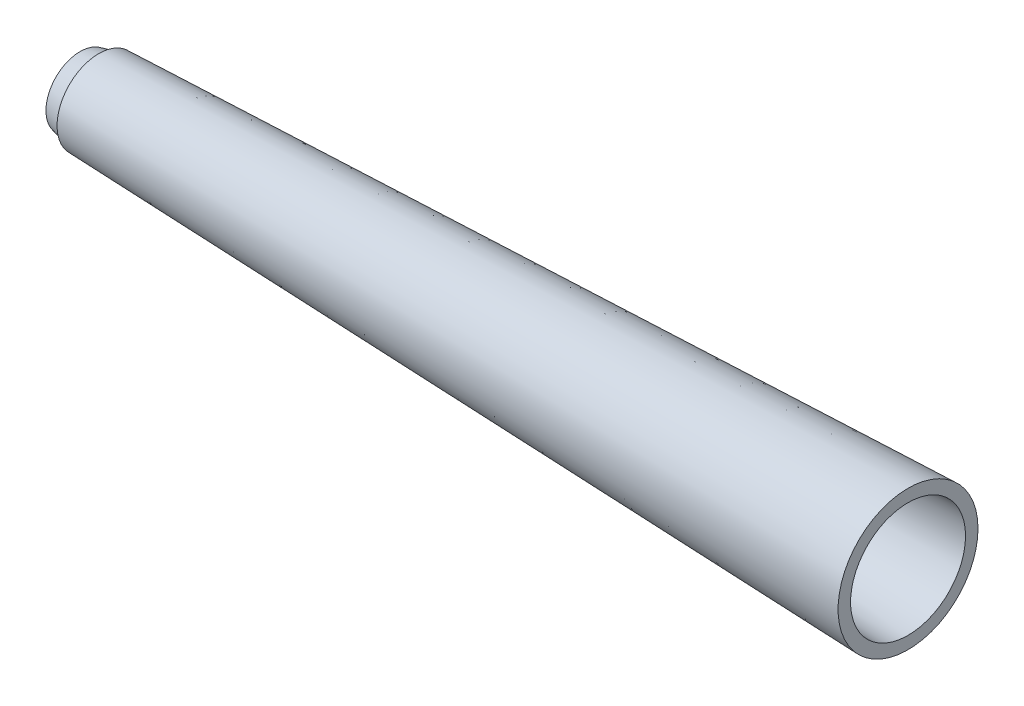
ISO-10303-21;
HEADER;
FILE_DESCRIPTION(('STEP AP214'),'2;1');
FILE_NAME('part.step','',(''),(''),'','','');
FILE_SCHEMA(('AUTOMOTIVE_DESIGN { 1 0 10303 214 1 1 1 1 }'));
ENDSEC;
DATA;
#1=APPLICATION_CONTEXT('core data for automotive mechanical design processes');
#2=APPLICATION_PROTOCOL_DEFINITION('international standard','automotive_design',2000,#1);
#3=PRODUCT_CONTEXT('',#1,'mechanical');
#4=PRODUCT('Part','Part','',(#3));
#5=PRODUCT_RELATED_PRODUCT_CATEGORY('part','',(#4));
#6=PRODUCT_DEFINITION_FORMATION('','',#4);
#7=PRODUCT_DEFINITION_CONTEXT('part definition',#1,'design');
#8=PRODUCT_DEFINITION('design','',#6,#7);
#9=PRODUCT_DEFINITION_SHAPE('','',#8);
#10=(LENGTH_UNIT() NAMED_UNIT(*) SI_UNIT(.MILLI.,.METRE.));
#11=(NAMED_UNIT(*) PLANE_ANGLE_UNIT() SI_UNIT($,.RADIAN.));
#12=(NAMED_UNIT(*) SI_UNIT($,.STERADIAN.) SOLID_ANGLE_UNIT());
#13=UNCERTAINTY_MEASURE_WITH_UNIT(LENGTH_MEASURE(1.E-05),#10,'distance_accuracy_value','');
#14=(GEOMETRIC_REPRESENTATION_CONTEXT(3) GLOBAL_UNCERTAINTY_ASSIGNED_CONTEXT((#13)) GLOBAL_UNIT_ASSIGNED_CONTEXT((#10,
#11,#12)) REPRESENTATION_CONTEXT('',''));
#15=CARTESIAN_POINT('',(0.,0.,0.));
#16=DIRECTION('',(0.,0.,1.));
#17=DIRECTION('',(1.,0.,0.));
#18=AXIS2_PLACEMENT_3D('',#15,#16,#17);
#19=CARTESIAN_POINT('',(50.,0.,0.));
#20=DIRECTION('',(1.,0.,0.));
#21=DIRECTION('',(0.,0.,-1.));
#22=AXIS2_PLACEMENT_3D('',#19,#20,#21);
#23=PLANE('',#22);
#24=CARTESIAN_POINT('',(50.,0.,-4.69512150857789));
#25=CARTESIAN_POINT('',(50.,0.0774556761758535,-4.69512749262268));
#26=CARTESIAN_POINT('',(50.,0.154915312597304,-4.69327648573209));
#27=CARTESIAN_POINT('',(50.,0.309100210130943,-4.68582458036986));
#28=CARTESIAN_POINT('',(50.,0.385826771823269,-4.68025048931462));
#29=CARTESIAN_POINT('',(50.,0.538546502530484,-4.66535384235011));
#30=CARTESIAN_POINT('',(50.,0.614541424083018,-4.65604932218945));
#31=CARTESIAN_POINT('',(50.,0.76579697551787,-4.63370275998921));
#32=CARTESIAN_POINT('',(50.,0.841058913887476,-4.62066957845393));
#33=CARTESIAN_POINT('',(50.,0.990849253858552,-4.59087446234744));
#34=CARTESIAN_POINT('',(50.,1.06537757810596,-4.57411213887261));
#35=CARTESIAN_POINT('',(50.,1.213702240403,-4.53686835826448));
#36=CARTESIAN_POINT('',(50.,1.28749620492464,-4.51637745343878));
#37=CARTESIAN_POINT('',(50.,1.43435449893985,-4.47168482052722));
#38=CARTESIAN_POINT('',(50.,1.50741332942991,-4.44746503631701));
#39=CARTESIAN_POINT('',(50.,1.65280508571756,-4.39532565627679));
#40=CARTESIAN_POINT('',(50.,1.72512869039417,-4.36738010304966));
#41=CARTESIAN_POINT('',(50.,1.86828646672253,-4.30810439259191));
#42=CARTESIAN_POINT('',(50.,1.93912212392569,-4.27677782356728));
#43=CARTESIAN_POINT('',(50.,2.07868486110722,-4.21092800335479));
#44=CARTESIAN_POINT('',(50.,2.14742326666067,-4.17642878296646));
#45=CARTESIAN_POINT('',(50.,2.28279417229262,-4.10424450232997));
#46=CARTESIAN_POINT('',(50.,2.34943502362547,-4.06657511019382));
#47=CARTESIAN_POINT('',(50.,2.48061389131729,-3.9880583457423));
#48=CARTESIAN_POINT('',(50.,2.54515631183587,-3.94721833343439));
#49=CARTESIAN_POINT('',(50.,2.67214247439441,-3.86236883793473));
#50=CARTESIAN_POINT('',(50.,2.73458577583404,-3.81835869535734));
#51=CARTESIAN_POINT('',(50.,2.85737884086232,-3.72717707392558));
#52=CARTESIAN_POINT('',(50.,2.91772255538123,-3.67999745096399));
#53=CARTESIAN_POINT('',(50.,3.03632172731316,-3.58248358830625));
#54=CARTESIAN_POINT('',(50.,3.09456493859665,-3.53213446103621));
#55=CARTESIAN_POINT('',(50.,3.20897113881356,-3.42829067721484));
#56=CARTESIAN_POINT('',(50.,3.26511532154908,-3.37477531936968));
#57=CARTESIAN_POINT('',(50.,3.37471148813169,-3.26520688013156));
#58=CARTESIAN_POINT('',(50.,3.42816717413037,-3.20915750218508));
#59=CARTESIAN_POINT('',(50.,3.53190686308197,-3.09491202108239));
#60=CARTESIAN_POINT('',(50.,3.58221052774977,-3.03673378743318));
#61=CARTESIAN_POINT('',(50.,3.67965316388938,-2.91823996070821));
#62=CARTESIAN_POINT('',(50.,3.72680584647773,-2.85793564683152));
#63=CARTESIAN_POINT('',(50.,3.81795226441296,-2.73519564771483));
#64=CARTESIAN_POINT('',(50.,3.86195288527225,-2.67276507688261));
#65=CARTESIAN_POINT('',(50.,3.94680230241528,-2.54577886092025));
#66=CARTESIAN_POINT('',(50.,3.98765043930259,-2.4812227752088));
#67=CARTESIAN_POINT('',(50.,4.06620274381422,-2.34999107068442));
#68=CARTESIAN_POINT('',(50.,4.10389820620797,-2.28331024257235));
#69=CARTESIAN_POINT('',(50.,4.17615261383283,-2.14783324230592));
#70=CARTESIAN_POINT('',(50.,4.2106945478897,-2.07902800221967));
#71=CARTESIAN_POINT('',(50.,4.27665279910241,-1.93930749844782));
#72=CARTESIAN_POINT('',(50.,4.30804381955396,-1.86838030608012));
#73=CARTESIAN_POINT('',(50.,4.36736744827808,-1.72521163043995));
#74=CARTESIAN_POINT('',(50.,4.39530489414029,-1.65297215195379));
#75=CARTESIAN_POINT('',(50.,4.44742801663569,-1.50772363004483));
#76=CARTESIAN_POINT('',(50.,4.47163869668915,-1.43472357168134));
#77=CARTESIAN_POINT('',(50.,4.51631832948614,-1.28795986798325));
#78=CARTESIAN_POINT('',(50.,4.53680426601222,-1.21420139625269));
#79=CARTESIAN_POINT('',(50.,4.57404201185416,-1.06592419918533));
#80=CARTESIAN_POINT('',(50.,4.59080213975315,-0.991407563973682));
#81=CARTESIAN_POINT('',(50.,4.6205972586095,-0.841617131948437));
#82=CARTESIAN_POINT('',(50.,4.63363147176082,-0.766343180430876));
#83=CARTESIAN_POINT('',(50.,4.65598413900821,-0.615040229093642));
#84=CARTESIAN_POINT('',(50.,4.66529255700744,-0.53900974785662));
#85=CARTESIAN_POINT('',(50.,4.68020212187726,-0.3861947554712));
#86=CARTESIAN_POINT('',(50.,4.68578408232483,-0.309408376540679));
#87=CARTESIAN_POINT('',(50.,4.69325283866525,-0.155082332867053));
#88=CARTESIAN_POINT('',(50.,4.69511169854175,-0.0775413280883341));
#89=CARTESIAN_POINT('',(50.,4.69513130471307,0.077431450892754));
#90=CARTESIAN_POINT('',(50.,4.69329728755643,0.154863224179503));
#91=CARTESIAN_POINT('',(50.,4.68586857069038,0.309002016120885));
#92=CARTESIAN_POINT('',(50.,4.68030040956254,0.385710302057824));
#93=CARTESIAN_POINT('',(50.,4.66541496994597,0.538400439255638));
#94=CARTESIAN_POINT('',(50.,4.65611536227887,0.614384010141844));
#95=CARTESIAN_POINT('',(50.,4.63377532678387,0.765624546042876));
#96=CARTESIAN_POINT('',(50.,4.62074338418093,0.84088276341779));
#97=CARTESIAN_POINT('',(50.,4.59094816799817,0.99067317608361));
#98=CARTESIAN_POINT('',(50.,4.57418411661665,1.06520521664885));
#99=CARTESIAN_POINT('',(50.,4.53693415563886,1.2135449120226));
#100=CARTESIAN_POINT('',(50.,4.51643840698427,1.28735009483429));
#101=CARTESIAN_POINT('',(50.,4.47173328300328,1.43423838201946));
#102=CARTESIAN_POINT('',(50.,4.44750546696408,1.50731586967241));
#103=CARTESIAN_POINT('',(50.,4.39534767798401,1.65275271206771));
#104=CARTESIAN_POINT('',(50.,4.36739138271999,1.72510261419092));
#105=CARTESIAN_POINT('',(50.,4.30810398147681,1.86828629574479));
#106=CARTESIAN_POINT('',(50.,4.27677771378806,1.9391220782699));
#107=CARTESIAN_POINT('',(50.,4.21092811236203,2.07868490644209));
#108=CARTESIAN_POINT('',(50.,4.17642881210913,2.14742327878085));
#109=CARTESIAN_POINT('',(50.,4.10424447332384,2.28279416022946));
#110=CARTESIAN_POINT('',(50.,4.06657510242974,2.34943502039662));
#111=CARTESIAN_POINT('',(50.,3.98805835348902,2.48061389453921));
#112=CARTESIAN_POINT('',(50.,3.94721833551059,2.54515631269949));
#113=CARTESIAN_POINT('',(50.,3.86236883585826,2.67214247353098));
#114=CARTESIAN_POINT('',(50.,3.81835869480021,2.73458577560249));
#115=CARTESIAN_POINT('',(50.,3.72717707448435,2.85737884109484));
#116=CARTESIAN_POINT('',(50.,3.67999745111415,2.91772255544381));
#117=CARTESIAN_POINT('',(50.,3.58248358815544,3.03632172725055));
#118=CARTESIAN_POINT('',(50.,3.5321344609957,3.09456493857989));
#119=CARTESIAN_POINT('',(50.,3.42829067725573,3.20897113883061));
#120=CARTESIAN_POINT('',(50.,3.37477531938064,3.26511532155365));
#121=CARTESIAN_POINT('',(50.,3.26520688012053,3.37471148812721));
#122=CARTESIAN_POINT('',(50.,3.20915750218196,3.42816717412927));
#123=CARTESIAN_POINT('',(50.,3.09491202108492,3.53190686308339));
#124=CARTESIAN_POINT('',(50.,3.03673378743352,3.58221052775035));
#125=CARTESIAN_POINT('',(50.,2.91823996070689,3.67965316388938));
#126=CARTESIAN_POINT('',(50.,2.85793564683073,3.72680584647799));
#127=CARTESIAN_POINT('',(50.,2.73519564771439,3.81795226441342));
#128=CARTESIAN_POINT('',(50.,2.67276507688201,3.86195288527266));
#129=CARTESIAN_POINT('',(50.,2.54577886091954,3.94680230241565));
#130=CARTESIAN_POINT('',(50.,2.48122277520814,3.98765043930297));
#131=CARTESIAN_POINT('',(50.,2.34999107068385,4.06620274381458));
#132=CARTESIAN_POINT('',(50.,2.28331024257181,4.10389820620829));
#133=CARTESIAN_POINT('',(50.,2.14783324230549,4.17615261383309));
#134=CARTESIAN_POINT('',(50.,2.07902800221931,4.21069454788991));
#135=CARTESIAN_POINT('',(50.,1.93930749844763,4.27665279910253));
#136=CARTESIAN_POINT('',(50.,1.86838030608002,4.30804381955402));
#137=CARTESIAN_POINT('',(50.,1.72521163043991,4.36736744827808));
#138=CARTESIAN_POINT('',(50.,1.65297215195371,4.39530489414029));
#139=CARTESIAN_POINT('',(50.,1.50772363004468,4.44742801663568));
#140=CARTESIAN_POINT('',(50.,1.43472357168115,4.47163869668915));
#141=CARTESIAN_POINT('',(50.,1.28795986798301,4.51631832948614));
#142=CARTESIAN_POINT('',(50.,1.21420139625243,4.53680426601222));
#143=CARTESIAN_POINT('',(50.,1.06592419918504,4.57404201185416));
#144=CARTESIAN_POINT('',(50.,0.991407563973395,4.59080213975315));
#145=CARTESIAN_POINT('',(50.,0.84161713194815,4.6205972586095));
#146=CARTESIAN_POINT('',(50.,0.766343180430595,4.63363147176082));
#147=CARTESIAN_POINT('',(50.,0.615040229093385,4.6559841390082));
#148=CARTESIAN_POINT('',(50.,0.539009747856382,4.66529255700744));
#149=CARTESIAN_POINT('',(50.,0.386194755471011,4.68020212187726));
#150=CARTESIAN_POINT('',(50.,0.309408376540521,4.68578408232483));
#151=CARTESIAN_POINT('',(50.,0.155082332866968,4.69325283866525));
#152=CARTESIAN_POINT('',(50.,0.0775413280882919,4.69511169854175));
#153=CARTESIAN_POINT('',(50.,-0.0774314508927209,4.69513130471307));
#154=CARTESIAN_POINT('',(50.,-0.154863224179438,4.69329728755643));
#155=CARTESIAN_POINT('',(50.,-0.309002016120763,4.68586857069038));
#156=CARTESIAN_POINT('',(50.,-0.385710302057679,4.68030040956254));
#157=CARTESIAN_POINT('',(50.,-0.538400439255456,4.66541496994597));
#158=CARTESIAN_POINT('',(50.,-0.614384010141647,4.65611536227887));
#159=CARTESIAN_POINT('',(50.,-0.76562454604266,4.63377532678387));
#160=CARTESIAN_POINT('',(50.,-0.840882763417571,4.62074338418092));
#161=CARTESIAN_POINT('',(50.,-0.99067317608339,4.59094816799817));
#162=CARTESIAN_POINT('',(50.,-1.06520521664864,4.57418411661665));
#163=CARTESIAN_POINT('',(50.,-1.2135449120224,4.53693415563886));
#164=CARTESIAN_POINT('',(50.,-1.28735009483411,4.51643840698427));
#165=CARTESIAN_POINT('',(50.,-1.43423838201932,4.47173328300328));
#166=CARTESIAN_POINT('',(50.,-1.50731586967228,4.44750546696408));
#167=CARTESIAN_POINT('',(50.,-1.65275271206764,4.39534767798401));
#168=CARTESIAN_POINT('',(50.,-1.72510261419089,4.36739138271999));
#169=CARTESIAN_POINT('',(50.,-1.86828629574473,4.30810398147684));
#170=CARTESIAN_POINT('',(50.,-1.93912207826978,4.27677771378814));
#171=CARTESIAN_POINT('',(50.,-2.07868490644188,4.21092811236217));
#172=CARTESIAN_POINT('',(50.,-2.1474232787806,4.17642881210929));
#173=CARTESIAN_POINT('',(50.,-2.28279416022914,4.10424447332404));
#174=CARTESIAN_POINT('',(50.,-2.34943502039628,4.06657510242997));
#175=CARTESIAN_POINT('',(50.,-2.48061389453883,3.98805835348926));
#176=CARTESIAN_POINT('',(50.,-2.54515631269911,3.94721833551084));
#177=CARTESIAN_POINT('',(50.,-2.6721424735306,3.86236883585851));
#178=CARTESIAN_POINT('',(50.,-2.73458577560212,3.81835869480046));
#179=CARTESIAN_POINT('',(50.,-2.8573788410945,3.72717707448457));
#180=CARTESIAN_POINT('',(50.,-2.9177225554435,3.67999745111436));
#181=CARTESIAN_POINT('',(50.,-3.03632172725029,3.58248358815561));
#182=CARTESIAN_POINT('',(50.,-3.09456493857968,3.53213446099584));
#183=CARTESIAN_POINT('',(50.,-3.2089711388305,3.42829067725581));
#184=CARTESIAN_POINT('',(50.,-3.2651153215536,3.37477531938067));
#185=CARTESIAN_POINT('',(50.,-3.37471148812714,3.26520688012062));
#186=CARTESIAN_POINT('',(50.,-3.42816717412914,3.20915750218214));
#187=CARTESIAN_POINT('',(50.,-3.53190686308314,3.09491202108524));
#188=CARTESIAN_POINT('',(50.,-3.58221052775005,3.0367337874339));
#189=CARTESIAN_POINT('',(50.,-3.679653163889,2.91823996070738));
#190=CARTESIAN_POINT('',(50.,-3.72680584647759,2.85793564683125));
#191=CARTESIAN_POINT('',(50.,-3.81795226441298,2.73519564771497));
#192=CARTESIAN_POINT('',(50.,-3.8619528852722,2.6727650768826));
#193=CARTESIAN_POINT('',(50.,-3.94680230241519,2.54577886092012));
#194=CARTESIAN_POINT('',(50.,-3.98765043930252,2.48122277520871));
#195=CARTESIAN_POINT('',(50.,-4.06620274381417,2.34999107068438));
#196=CARTESIAN_POINT('',(50.,-4.10389820620791,2.2833102425723));
#197=CARTESIAN_POINT('',(50.,-4.17615261383278,2.14783324230587));
#198=CARTESIAN_POINT('',(50.,-4.21069454788966,2.07902800221964));
#199=CARTESIAN_POINT('',(50.,-4.27665279910239,1.9393074984478));
#200=CARTESIAN_POINT('',(50.,-4.30804381955395,1.86838030608011));
#201=CARTESIAN_POINT('',(50.,-4.36736744827808,1.72521163043999));
#202=CARTESIAN_POINT('',(50.,-4.39530489414029,1.65297215195386));
#203=CARTESIAN_POINT('',(50.,-4.44742801663569,1.50772363004496));
#204=CARTESIAN_POINT('',(50.,-4.47163869668915,1.43472357168149));
#205=CARTESIAN_POINT('',(50.,-4.51631832948614,1.28795986798344));
#206=CARTESIAN_POINT('',(50.,-4.53680426601222,1.21420139625289));
#207=CARTESIAN_POINT('',(50.,-4.57404201185416,1.06592419918554));
#208=CARTESIAN_POINT('',(50.,-4.59080213975315,0.991407563973905));
#209=CARTESIAN_POINT('',(50.,-4.6205972586095,0.84161713194866));
#210=CARTESIAN_POINT('',(50.,-4.63363147176082,0.766343180431094));
#211=CARTESIAN_POINT('',(50.,-4.65598413900821,0.615040229093841));
#212=CARTESIAN_POINT('',(50.,-4.66529255700744,0.539009747856804));
#213=CARTESIAN_POINT('',(50.,-4.68020212187726,0.386194755471347));
#214=CARTESIAN_POINT('',(50.,-4.68578408232483,0.309408376540803));
#215=CARTESIAN_POINT('',(50.,-4.69325283866525,0.15508233286712));
#216=CARTESIAN_POINT('',(50.,-4.69511169854175,0.0775413280883679));
#217=CARTESIAN_POINT('',(50.,-4.69513130471307,-0.077431450892796));
#218=CARTESIAN_POINT('',(50.,-4.69329728755643,-0.154863224179588));
#219=CARTESIAN_POINT('',(50.,-4.68586857069038,-0.309002016121043));
#220=CARTESIAN_POINT('',(50.,-4.68030040956254,-0.385710302058013));
#221=CARTESIAN_POINT('',(50.,-4.66541496994597,-0.538400439255876));
#222=CARTESIAN_POINT('',(50.,-4.65611536227887,-0.6143840101421));
#223=CARTESIAN_POINT('',(50.,-4.63377532678387,-0.765624546043157));
#224=CARTESIAN_POINT('',(50.,-4.62074338418093,-0.840882763418078));
#225=CARTESIAN_POINT('',(50.,-4.59094816799818,-0.990673176083897));
#226=CARTESIAN_POINT('',(50.,-4.57418411661665,-1.06520521664913));
#227=CARTESIAN_POINT('',(50.,-4.53693415563886,-1.21354491202286));
#228=CARTESIAN_POINT('',(50.,-4.51643840698428,-1.28735009483453));
#229=CARTESIAN_POINT('',(50.,-4.47173328300328,-1.43423838201966));
#230=CARTESIAN_POINT('',(50.,-4.44750546696408,-1.50731586967257));
#231=CARTESIAN_POINT('',(50.,-4.39534767798401,-1.6527527120678));
#232=CARTESIAN_POINT('',(50.,-4.36739138271999,-1.72510261419097));
#233=CARTESIAN_POINT('',(50.,-4.30810398147676,-1.86828629574486));
#234=CARTESIAN_POINT('',(50.,-4.27677771378797,-1.93912207827003));
#235=CARTESIAN_POINT('',(50.,-4.21092811236186,-2.07868490644233));
#236=CARTESIAN_POINT('',(50.,-4.17642881210893,-2.14742327878113));
#237=CARTESIAN_POINT('',(50.,-4.10424447332359,-2.28279416022981));
#238=CARTESIAN_POINT('',(50.,-4.06657510242948,-2.34943502039702));
#239=CARTESIAN_POINT('',(50.,-3.98805835348872,-2.48061389453961));
#240=CARTESIAN_POINT('',(50.,-3.94721833551027,-2.54515631269986));
#241=CARTESIAN_POINT('',(50.,-3.86236883585799,-2.67214247353147));
#242=CARTESIAN_POINT('',(50.,-3.81835869480001,-2.73458577560312));
#243=CARTESIAN_POINT('',(50.,-3.727177074484,-2.85737884109502));
#244=CARTESIAN_POINT('',(50.,-3.67999745111359,-2.91772255544339));
#245=CARTESIAN_POINT('',(50.,-3.58248358815557,-3.03632172725161));
#246=CARTESIAN_POINT('',(50.,-3.53213446099675,-3.09456493858304));
#247=CARTESIAN_POINT('',(50.,-3.42829067725442,-3.20897113882781));
#248=CARTESIAN_POINT('',(50.,-3.37477531937602,-3.26511532154274));
#249=CARTESIAN_POINT('',(50.,-3.26520688012512,-3.37471148813813));
#250=CARTESIAN_POINT('',(50.,-3.20915750219905,-3.42816717417008));
#251=CARTESIAN_POINT('',(50.,-3.09491202106806,-3.53190686304264));
#252=CARTESIAN_POINT('',(50.,-3.03673378737065,-3.58221052759914));
#253=CARTESIAN_POINT('',(50.,-2.91823996076967,-3.67965316403947));
#254=CARTESIAN_POINT('',(50.,-2.85793564706415,-3.72680584703739));
#255=CARTESIAN_POINT('',(50.,-2.73519564748175,-3.81795226385479));
#256=CARTESIAN_POINT('',(50.,-2.67276507601446,-3.86195288319106));
#257=CARTESIAN_POINT('',(50.,-2.54577886178754,-3.94680230449715));
#258=CARTESIAN_POINT('',(50.,-2.48122277844722,-3.98765044707204));
#259=CARTESIAN_POINT('',(50.,-2.34999106743636,-4.06620273602421));
#260=CARTESIAN_POINT('',(50.,-2.28331023043661,-4.1038981770988));
#261=CARTESIAN_POINT('',(50.,-2.1478332545029,-4.17615264309091));
#262=CARTESIAN_POINT('',(50.,-2.07902804785243,-4.21069465735085));
#263=CARTESIAN_POINT('',(50.,-1.93930745247348,-4.27665268882305));
#264=CARTESIAN_POINT('',(50.,-1.86838013387628,-4.30804340648466));
#265=CARTESIAN_POINT('',(50.,-1.72518553597382,-4.36737874474295));
#266=CARTESIAN_POINT('',(50.,-1.65291974233676,-4.3953269502958));
#267=CARTESIAN_POINT('',(50.,-1.50762610167962,-4.4474685138979));
#268=CARTESIAN_POINT('',(50.,-1.43460737198423,-4.47168724214362));
#269=CARTESIAN_POINT('',(50.,-1.28781365743628,-4.51637937743146));
#270=CARTESIAN_POINT('',(50.,-1.21404396412532,-4.53687015375063));
#271=CARTESIAN_POINT('',(50.,-1.06575171069198,-4.57411412227401));
#272=CARTESIAN_POINT('',(50.,-0.991231339343665,-4.59087602482301));
#273=CARTESIAN_POINT('',(50.,-0.841440881345585,-4.62067112333707));
#274=CARTESIAN_POINT('',(50.,-0.766170717343436,-4.63370393037967));
#275=CARTESIAN_POINT('',(50.,-0.614882616948982,-4.65605051101887));
#276=CARTESIAN_POINT('',(50.,-0.538863254456393,-4.66535462510893));
#277=CARTESIAN_POINT('',(50.,-0.386078533048034,-4.68025127508642));
#278=CARTESIAN_POINT('',(50.,-0.30931134481741,-4.68582497437604));
#279=CARTESIAN_POINT('',(50.,-0.155028968040738,-4.69327686297905));
#280=CARTESIAN_POINT('',(50.,-0.0775124416546672,-4.69512746288594));
#281=CARTESIAN_POINT('',(50.,0.,-4.69512150857789));
#282=B_SPLINE_CURVE_WITH_KNOTS('',3,(#24,#25,#26,#27,#28,#29,#30,#31,#32,#33,#34,#35,#36,#37,
#38,#39,#40,#41,#42,#43,#44,#45,#46,#47,#48,#49,#50,#51,#52,#53,#54,#55,#56,#57,#58,#59,#60,#61,
#62,#63,#64,#65,#66,#67,#68,#69,#70,#71,#72,#73,#74,#75,#76,#77,#78,#79,#80,#81,#82,#83,#84,#85,
#86,#87,#88,#89,#90,#91,#92,#93,#94,#95,#96,#97,#98,#99,#100,#101,#102,#103,#104,#105,#106,#107,
#108,#109,#110,#111,#112,#113,#114,#115,#116,#117,#118,#119,#120,#121,#122,#123,#124,#125,#126,
#127,#128,#129,#130,#131,#132,#133,#134,#135,#136,#137,#138,#139,#140,#141,#142,#143,#144,#145,
#146,#147,#148,#149,#150,#151,#152,#153,#154,#155,#156,#157,#158,#159,#160,#161,#162,#163,#164,
#165,#166,#167,#168,#169,#170,#171,#172,#173,#174,#175,#176,#177,#178,#179,#180,#181,#182,#183,
#184,#185,#186,#187,#188,#189,#190,#191,#192,#193,#194,#195,#196,#197,#198,#199,#200,#201,#202,
#203,#204,#205,#206,#207,#208,#209,#210,#211,#212,#213,#214,#215,#216,#217,#218,#219,#220,#221,
#222,#223,#224,#225,#226,#227,#228,#229,#230,#231,#232,#233,#234,#235,#236,#237,#238,#239,#240,
#241,#242,#243,#244,#245,#246,#247,#248,#249,#250,#251,#252,#253,#254,#255,#256,#257,#258,#259,
#260,#261,#262,#263,#264,#265,#266,#267,#268,#269,#270,#271,#272,#273,#274,#275,#276,#277,#278,
#279,#280,#281),.UNSPECIFIED.,.F.,.F.,(4,2,2,2,2,2,2,2,2,2,2,2,2,2,2,2,2,2,2,2,2,2,2,2,2,2,2,2,
2,2,2,2,2,2,2,2,2,2,2,2,2,2,2,2,2,2,2,2,2,2,2,2,2,2,2,2,2,2,2,2,2,2,2,2,2,2,2,2,2,2,2,2,2,2,2,2,
2,2,2,2,2,2,2,2,2,2,2,2,2,2,2,2,2,2,2,2,2,2,2,2,2,2,2,2,2,2,2,2,2,2,2,2,2,2,2,2,2,2,2,2,2,2,2,2,
2,2,2,2,4),(0.,0.232350454528204,0.463045690710972,0.692638766331721,0.921690722983873,
1.1507665781432,1.38043117290126,1.61124502614973,1.84376034546233,2.07603128317391,
2.30666872164152,2.53622659509988,2.7652666707131,2.99435452489448,3.22405538113213,
3.45492996073226,3.68753049680452,3.91980143451585,4.15043887298327,4.37999674644153,
4.6090368220547,4.83812467623613,5.0678255324739,5.29870011207423,5.53130064814679,
5.76357158585854,5.99420902432625,6.22376689778469,6.45280697339792,6.68189482757929,
6.91159568381688,7.14247026341692,7.37507079948907,7.60734173720091,7.8379791756687,
8.06753704912718,8.29657712474043,8.52566497892178,8.75536583515932,8.98624041475927,
9.2188409508313,9.45111188854294,9.68174932701059,9.91130720046898,10.1403472760822,
10.3694351302636,10.5991359865012,10.8300105661013,11.0626111021735,11.2948820398852,
11.5255194783529,11.7550773518113,11.9841174274245,12.2132052816059,12.4429061378435,
12.6737807174436,12.9063812535158,13.1386521912277,13.3692896296955,13.598847503154,
13.8278875787672,14.0569754329486,14.2866762891861,14.517550868786,14.7501514048581,
14.9824223425698,15.2130597810375,15.442617654496,15.6716577301092,15.9007455842906,
16.1304464405281,16.3613210201282,16.5939215562003,16.8261924939117,17.0568299323792,
17.2863878058375,17.5154278814507,17.7445157356321,17.9742165918698,18.2050911714701,
18.4376917075425,18.6699626452539,18.9006000837213,19.1301579571795,19.3591980327927,
19.5882858869741,19.8179867432119,20.0488613228122,20.2814618588848,20.5137327965964,
20.7443702350641,20.9739281085225,21.2029681841357,21.4320560383171,21.6617568945547,
21.8926314741548,22.125232010227,22.357502947939,22.5881403864069,22.8176982598654,
23.0467383354787,23.27582618966,23.5055270458975,23.7364016254974,23.9690021615693,
24.2012730992812,24.431910537749,24.6614684112075,24.8905084868207,25.1195963410021,
25.3492971972396,25.5801717768395,25.8127723129115,26.0450432506231,26.2756806890906,
26.505238562549,26.7342786381622,26.9633664923436,27.1930673485813,27.4239419281814,
27.6565424642537,27.8888986897661,28.1195969045399,28.3491910686352,28.5782431526571,
28.8073191167483,29.03698474451,29.2678014833906,29.5003224425342),.UNSPECIFIED.);
#283=CARTESIAN_POINT('',(50.,0.,-4.69512150857789));
#284=VERTEX_POINT('',#283);
#285=EDGE_CURVE('E76',#284,#284,#282,.T.);
#286=ORIENTED_EDGE('',*,*,#285,.T.);
#287=EDGE_LOOP('',(#286));
#288=FACE_BOUND('',#287,.T.);
#289=CARTESIAN_POINT('',(50.,0.,0.));
#290=DIRECTION('',(1.,0.,0.));
#291=DIRECTION('',(0.,0.,-1.));
#292=AXIS2_PLACEMENT_3D('',#289,#290,#291);
#293=CIRCLE('',#292,5.19634059717554);
#294=CARTESIAN_POINT('',(50.,0.,-5.19634059717554));
#295=VERTEX_POINT('',#294);
#296=EDGE_CURVE('E11',#295,#295,#293,.T.);
#297=ORIENTED_EDGE('',*,*,#296,.F.);
#298=EDGE_LOOP('',(#297));
#299=FACE_BOUND('',#298,.T.);
#300=ADVANCED_FACE('F44',(#288,#299),#23,.F.);
#301=CARTESIAN_POINT('',(50.,0.,0.));
#302=DIRECTION('',(1.,0.,0.));
#303=DIRECTION('',(0.,0.,-1.));
#304=AXIS2_PLACEMENT_3D('',#301,#302,#303);
#305=CONICAL_SURFACE('',#304,4.69512150857789,0.0349065850398873);
#306=CARTESIAN_POINT('',(180.,0.,0.));
#307=DIRECTION('',(1.,0.,0.));
#308=DIRECTION('',(0.,0.,-1.));
#309=AXIS2_PLACEMENT_3D('',#306,#307,#308);
#310=CIRCLE('',#309,9.2348215425052);
#311=CARTESIAN_POINT('',(180.,0.,-9.2348215425052));
#312=VERTEX_POINT('',#311);
#313=EDGE_CURVE('E55',#312,#312,#310,.T.);
#314=ORIENTED_EDGE('',*,*,#313,.T.);
#315=EDGE_LOOP('',(#314));
#316=FACE_BOUND('',#315,.T.);
#317=ORIENTED_EDGE('',*,*,#285,.F.);
#318=EDGE_LOOP('',(#317));
#319=FACE_BOUND('',#318,.T.);
#320=ADVANCED_FACE('F46',(#316,#319),#305,.F.);
#321=CARTESIAN_POINT('',(180.,9.2348215425052,0.));
#322=DIRECTION('',(1.,0.,0.));
#323=DIRECTION('',(0.,0.,-1.));
#324=AXIS2_PLACEMENT_3D('',#321,#322,#323);
#325=PLANE('',#324);
#326=CARTESIAN_POINT('',(180.,0.,0.));
#327=DIRECTION('',(1.,0.,0.));
#328=DIRECTION('',(0.,0.,-1.));
#329=AXIS2_PLACEMENT_3D('',#326,#327,#328);
#330=CIRCLE('',#329,11.2360406311028);
#331=CARTESIAN_POINT('',(180.,0.,-11.2360406311028));
#332=VERTEX_POINT('',#331);
#333=EDGE_CURVE('E61',#332,#332,#330,.T.);
#334=ORIENTED_EDGE('',*,*,#333,.T.);
#335=EDGE_LOOP('',(#334));
#336=FACE_BOUND('',#335,.T.);
#337=ORIENTED_EDGE('',*,*,#313,.F.);
#338=EDGE_LOOP('',(#337));
#339=FACE_BOUND('',#338,.T.);
#340=ADVANCED_FACE('F100',(#336,#339),#325,.T.);
#341=CARTESIAN_POINT('',(180.,0.,0.));
#342=DIRECTION('',(1.,0.,0.));
#343=DIRECTION('',(0.,0.,-1.));
#344=AXIS2_PLACEMENT_3D('',#341,#342,#343);
#345=CONICAL_SURFACE('',#344,11.2360406311028,0.0349065850398873);
#346=CARTESIAN_POINT('',(50.,0.,0.));
#347=DIRECTION('',(1.,0.,0.));
#348=DIRECTION('',(0.,0.,-1.));
#349=AXIS2_PLACEMENT_3D('',#346,#347,#348);
#350=CIRCLE('',#349,6.69634059717554);
#351=CARTESIAN_POINT('',(50.,0.,-6.69634059717554));
#352=VERTEX_POINT('',#351);
#353=EDGE_CURVE('E72',#352,#352,#350,.F.);
#354=ORIENTED_EDGE('',*,*,#353,.F.);
#355=EDGE_LOOP('',(#354));
#356=FACE_BOUND('',#355,.T.);
#357=ORIENTED_EDGE('',*,*,#333,.F.);
#358=EDGE_LOOP('',(#357));
#359=FACE_BOUND('',#358,.T.);
#360=ADVANCED_FACE('F96',(#356,#359),#345,.T.);
#361=CARTESIAN_POINT('',(50.,0.,0.));
#362=DIRECTION('',(1.,0.,0.));
#363=DIRECTION('',(0.,0.,-1.));
#364=AXIS2_PLACEMENT_3D('',#361,#362,#363);
#365=CIRCLE('',#364,6.19511964813495);
#366=CARTESIAN_POINT('',(50.,0.,-6.19511964813495));
#367=VERTEX_POINT('',#366);
#368=EDGE_CURVE('E68',#367,#367,#365,.T.);
#369=ORIENTED_EDGE('',*,*,#368,.T.);
#370=EDGE_LOOP('',(#369));
#371=FACE_BOUND('',#370,.T.);
#372=ORIENTED_EDGE('',*,*,#353,.T.);
#373=EDGE_LOOP('',(#372));
#374=FACE_BOUND('',#373,.T.);
#375=ADVANCED_FACE('F85',(#371,#374),#23,.F.);
#376=CARTESIAN_POINT('',(50.,0.,0.));
#377=DIRECTION('',(1.,0.,0.));
#378=DIRECTION('',(0.,0.,-1.));
#379=AXIS2_PLACEMENT_3D('',#376,#377,#378);
#380=CONICAL_SURFACE('',#379,6.19511964813495,0.23270688178031);
#381=CARTESIAN_POINT('',(47.,0.,0.));
#382=DIRECTION('',(1.,0.,0.));
#383=DIRECTION('',(0.,0.,-1.));
#384=AXIS2_PLACEMENT_3D('',#381,#382,#383);
#385=CIRCLE('',#384,5.48411826326383);
#386=CARTESIAN_POINT('',(47.,0.,-5.48411826326383));
#387=VERTEX_POINT('',#386);
#388=EDGE_CURVE('E64',#387,#387,#385,.T.);
#389=ORIENTED_EDGE('',*,*,#388,.T.);
#390=EDGE_LOOP('',(#389));
#391=FACE_BOUND('',#390,.T.);
#392=ORIENTED_EDGE('',*,*,#368,.F.);
#393=EDGE_LOOP('',(#392));
#394=FACE_BOUND('',#393,.T.);
#395=ADVANCED_FACE('F95',(#391,#394),#380,.T.);
#396=CARTESIAN_POINT('',(47.,0.,0.));
#397=DIRECTION('',(-1.,0.,0.));
#398=DIRECTION('',(0.,0.,1.));
#399=AXIS2_PLACEMENT_3D('',#396,#397,#398);
#400=CONICAL_SURFACE('',#399,5.48411826326383,0.0956332730379782);
#401=ORIENTED_EDGE('',*,*,#296,.T.);
#402=EDGE_LOOP('',(#401));
#403=FACE_BOUND('',#402,.T.);
#404=ORIENTED_EDGE('',*,*,#388,.F.);
#405=EDGE_LOOP('',(#404));
#406=FACE_BOUND('',#405,.T.);
#407=ADVANCED_FACE('F153',(#403,#406),#400,.F.);
#408=CLOSED_SHELL('',(#300,#320,#340,#360,#375,#395,#407));
#409=MANIFOLD_SOLID_BREP('B2',#408);
#410=ADVANCED_BREP_SHAPE_REPRESENTATION('',(#18,#409),#14);
#411=SHAPE_DEFINITION_REPRESENTATION(#9,#410);
ENDSEC;
END-ISO-10303-21;
